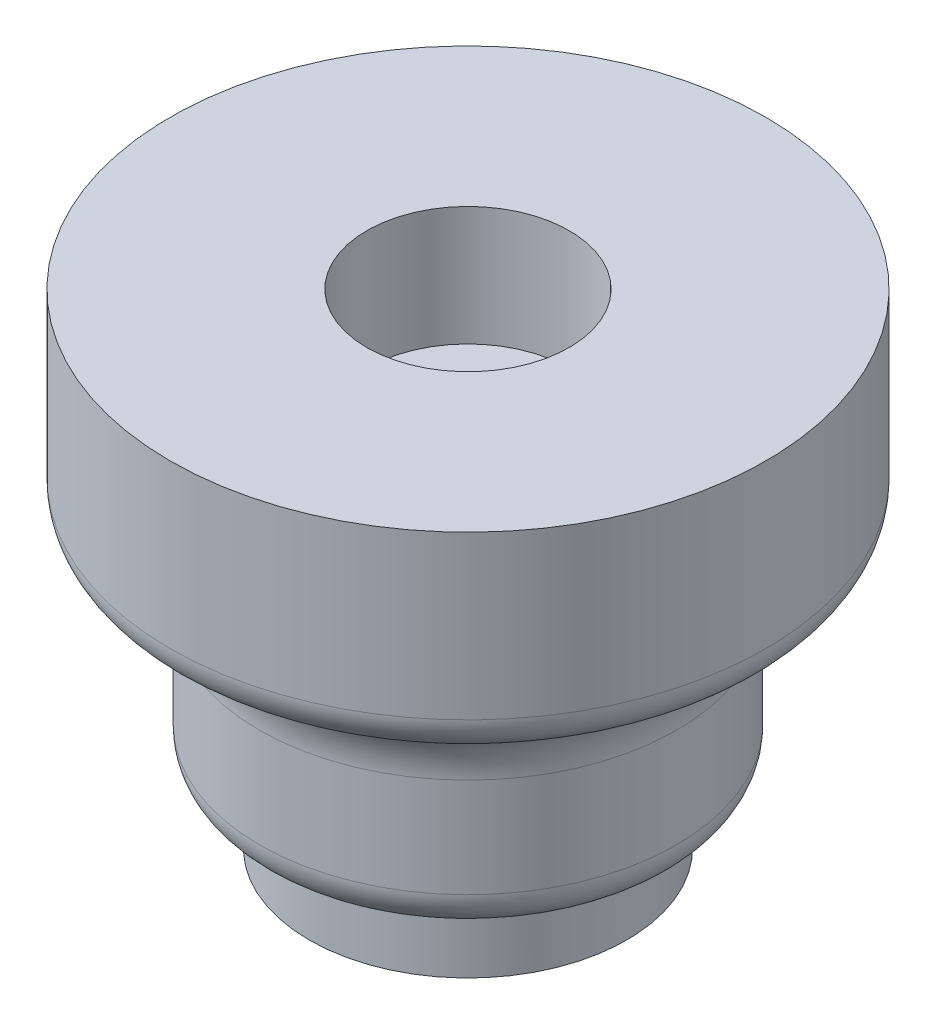
ISO-10303-21;
HEADER;
FILE_DESCRIPTION(('STEP AP214'),'2;1');
FILE_NAME('part.step','',(''),(''),'','','');
FILE_SCHEMA(('AUTOMOTIVE_DESIGN { 1 0 10303 214 1 1 1 1 }'));
ENDSEC;
DATA;
#1=APPLICATION_CONTEXT('core data for automotive mechanical design processes');
#2=APPLICATION_PROTOCOL_DEFINITION('international standard','automotive_design',2000,#1);
#3=PRODUCT_CONTEXT('',#1,'mechanical');
#4=PRODUCT('Part','Part','',(#3));
#5=PRODUCT_RELATED_PRODUCT_CATEGORY('part','',(#4));
#6=PRODUCT_DEFINITION_FORMATION('','',#4);
#7=PRODUCT_DEFINITION_CONTEXT('part definition',#1,'design');
#8=PRODUCT_DEFINITION('design','',#6,#7);
#9=PRODUCT_DEFINITION_SHAPE('','',#8);
#10=(LENGTH_UNIT() NAMED_UNIT(*) SI_UNIT(.MILLI.,.METRE.));
#11=(NAMED_UNIT(*) PLANE_ANGLE_UNIT() SI_UNIT($,.RADIAN.));
#12=(NAMED_UNIT(*) SI_UNIT($,.STERADIAN.) SOLID_ANGLE_UNIT());
#13=UNCERTAINTY_MEASURE_WITH_UNIT(LENGTH_MEASURE(1.E-05),#10,'distance_accuracy_value','');
#14=(GEOMETRIC_REPRESENTATION_CONTEXT(3) GLOBAL_UNCERTAINTY_ASSIGNED_CONTEXT((#13)) GLOBAL_UNIT_ASSIGNED_CONTEXT((#10,
#11,#12)) REPRESENTATION_CONTEXT('',''));
#15=CARTESIAN_POINT('',(0.,0.,0.));
#16=DIRECTION('',(0.,0.,1.));
#17=DIRECTION('',(1.,0.,0.));
#18=AXIS2_PLACEMENT_3D('',#15,#16,#17);
#19=CARTESIAN_POINT('',(0.,5.5,0.));
#20=DIRECTION('',(0.,-1.,0.));
#21=DIRECTION('',(0.,0.,-1.));
#22=AXIS2_PLACEMENT_3D('',#19,#20,#21);
#23=CYLINDRICAL_SURFACE('',#22,5.25);
#24=CARTESIAN_POINT('',(0.,1.,0.));
#25=DIRECTION('',(0.,1.,0.));
#26=DIRECTION('',(0.,0.,1.));
#27=AXIS2_PLACEMENT_3D('',#24,#25,#26);
#28=CIRCLE('',#27,5.25);
#29=CARTESIAN_POINT('',(0.,1.,5.25));
#30=VERTEX_POINT('',#29);
#31=EDGE_CURVE('E197',#30,#30,#28,.T.);
#32=ORIENTED_EDGE('',*,*,#31,.T.);
#33=EDGE_LOOP('',(#32));
#34=FACE_BOUND('',#33,.T.);
#35=CARTESIAN_POINT('',(0.,3.5,0.));
#36=DIRECTION('',(0.,1.,0.));
#37=DIRECTION('',(0.,0.,1.));
#38=AXIS2_PLACEMENT_3D('',#35,#36,#37);
#39=CIRCLE('',#38,5.25);
#40=CARTESIAN_POINT('',(0.,3.5,5.25));
#41=VERTEX_POINT('',#40);
#42=EDGE_CURVE('E193',#41,#41,#39,.F.);
#43=ORIENTED_EDGE('',*,*,#42,.T.);
#44=EDGE_LOOP('',(#43));
#45=FACE_BOUND('',#44,.T.);
#46=ADVANCED_FACE('F45',(#34,#45),#23,.T.);
#47=CARTESIAN_POINT('',(0.,0.,0.));
#48=DIRECTION('',(0.,1.,0.));
#49=DIRECTION('',(0.,0.,1.));
#50=AXIS2_PLACEMENT_3D('',#47,#48,#49);
#51=PLANE('',#50);
#52=CARTESIAN_POINT('',(0.,0.,0.));
#53=DIRECTION('',(0.,1.,0.));
#54=DIRECTION('',(0.,0.,1.));
#55=AXIS2_PLACEMENT_3D('',#52,#53,#54);
#56=CIRCLE('',#55,4.25);
#57=CARTESIAN_POINT('',(0.,0.,4.25));
#58=VERTEX_POINT('',#57);
#59=EDGE_CURVE('E201',#58,#58,#56,.F.);
#60=ORIENTED_EDGE('',*,*,#59,.T.);
#61=EDGE_LOOP('',(#60));
#62=FACE_BOUND('',#61,.T.);
#63=CARTESIAN_POINT('',(0.,0.,0.));
#64=DIRECTION('',(0.,1.,0.));
#65=DIRECTION('',(0.,0.,1.));
#66=AXIS2_PLACEMENT_3D('',#63,#64,#65);
#67=CIRCLE('',#66,4.15);
#68=CARTESIAN_POINT('',(0.,0.,4.15));
#69=VERTEX_POINT('',#68);
#70=EDGE_CURVE('E189',#69,#69,#67,.T.);
#71=ORIENTED_EDGE('',*,*,#70,.T.);
#72=EDGE_LOOP('',(#71));
#73=FACE_BOUND('',#72,.T.);
#74=ADVANCED_FACE('F222',(#62,#73),#51,.F.);
#75=CARTESIAN_POINT('',(0.,-1.7,0.));
#76=DIRECTION('',(0.,1.,0.));
#77=DIRECTION('',(0.,0.,1.));
#78=AXIS2_PLACEMENT_3D('',#75,#76,#77);
#79=CYLINDRICAL_SURFACE('',#78,4.);
#80=CARTESIAN_POINT('',(0.,-0.15,0.));
#81=DIRECTION('',(0.,1.,0.));
#82=DIRECTION('',(0.,0.,1.));
#83=AXIS2_PLACEMENT_3D('',#80,#81,#82);
#84=CIRCLE('',#83,4.);
#85=CARTESIAN_POINT('',(0.,-0.15,4.));
#86=VERTEX_POINT('',#85);
#87=EDGE_CURVE('E185',#86,#86,#84,.F.);
#88=ORIENTED_EDGE('',*,*,#87,.T.);
#89=EDGE_LOOP('',(#88));
#90=FACE_BOUND('',#89,.T.);
#91=CARTESIAN_POINT('',(0.,-1.7,0.));
#92=DIRECTION('',(0.,-1.,0.));
#93=DIRECTION('',(0.,0.,-1.));
#94=AXIS2_PLACEMENT_3D('',#91,#92,#93);
#95=CIRCLE('',#94,4.);
#96=CARTESIAN_POINT('',(0.,-1.7,-4.));
#97=VERTEX_POINT('',#96);
#98=EDGE_CURVE('E181',#97,#97,#95,.T.);
#99=ORIENTED_EDGE('',*,*,#98,.F.);
#100=EDGE_LOOP('',(#99));
#101=FACE_BOUND('',#100,.T.);
#102=ADVANCED_FACE('F229',(#90,#101),#79,.T.);
#103=CARTESIAN_POINT('',(0.,-1.7,0.));
#104=DIRECTION('',(0.,-1.,0.));
#105=DIRECTION('',(0.,0.,-1.));
#106=AXIS2_PLACEMENT_3D('',#103,#104,#105);
#107=PLANE('',#106);
#108=DIRECTION('',(0.5,0.,0.866025403784439));
#109=VECTOR('',#108,1.);
#110=CARTESIAN_POINT('',(1.35677313259562,-1.7,-2.35));
#111=LINE('',#110,#109);
#112=CARTESIAN_POINT('',(1.35677313259562,-1.7,-2.35));
#113=VERTEX_POINT('',#112);
#114=CARTESIAN_POINT('',(2.71354626519124,-1.7,0.));
#115=VERTEX_POINT('',#114);
#116=EDGE_CURVE('E61',#113,#115,#111,.T.);
#117=ORIENTED_EDGE('',*,*,#116,.F.);
#118=DIRECTION('',(1.,0.,0.));
#119=VECTOR('',#118,1.);
#120=CARTESIAN_POINT('',(-1.35677313259562,-1.7,-2.35));
#121=LINE('',#120,#119);
#122=CARTESIAN_POINT('',(-1.35677313259562,-1.7,-2.35));
#123=VERTEX_POINT('',#122);
#124=EDGE_CURVE('E154',#123,#113,#121,.T.);
#125=ORIENTED_EDGE('',*,*,#124,.F.);
#126=DIRECTION('',(0.5,0.,-0.866025403784439));
#127=VECTOR('',#126,1.);
#128=CARTESIAN_POINT('',(-2.71354626519124,-1.7,0.));
#129=LINE('',#128,#127);
#130=CARTESIAN_POINT('',(-2.71354626519124,-1.7,0.));
#131=VERTEX_POINT('',#130);
#132=EDGE_CURVE('E151',#131,#123,#129,.T.);
#133=ORIENTED_EDGE('',*,*,#132,.F.);
#134=DIRECTION('',(-0.5,0.,-0.866025403784439));
#135=VECTOR('',#134,1.);
#136=CARTESIAN_POINT('',(-1.35677313259562,-1.7,2.35));
#137=LINE('',#136,#135);
#138=CARTESIAN_POINT('',(-1.35677313259562,-1.7,2.35));
#139=VERTEX_POINT('',#138);
#140=EDGE_CURVE('E109',#139,#131,#137,.T.);
#141=ORIENTED_EDGE('',*,*,#140,.F.);
#142=DIRECTION('',(-1.,0.,0.));
#143=VECTOR('',#142,1.);
#144=CARTESIAN_POINT('',(1.35677313259562,-1.7,2.35));
#145=LINE('',#144,#143);
#146=CARTESIAN_POINT('',(1.35677313259562,-1.7,2.35));
#147=VERTEX_POINT('',#146);
#148=EDGE_CURVE('E145',#147,#139,#145,.T.);
#149=ORIENTED_EDGE('',*,*,#148,.F.);
#150=DIRECTION('',(-0.5,0.,0.866025403784439));
#151=VECTOR('',#150,1.);
#152=CARTESIAN_POINT('',(2.71354626519124,-1.7,0.));
#153=LINE('',#152,#151);
#154=EDGE_CURVE('E141',#115,#147,#153,.T.);
#155=ORIENTED_EDGE('',*,*,#154,.F.);
#156=EDGE_LOOP('',(#117,#125,#133,#141,#149,#155));
#157=FACE_BOUND('',#156,.T.);
#158=ORIENTED_EDGE('',*,*,#98,.T.);
#159=EDGE_LOOP('',(#158));
#160=FACE_BOUND('',#159,.T.);
#161=ADVANCED_FACE('F238',(#157,#160),#107,.T.);
#162=CARTESIAN_POINT('',(0.,-0.15,0.));
#163=DIRECTION('',(0.,1.,0.));
#164=DIRECTION('',(0.,0.,1.));
#165=AXIS2_PLACEMENT_3D('',#162,#163,#164);
#166=TOROIDAL_SURFACE('',#165,4.15,0.15);
#167=ORIENTED_EDGE('',*,*,#70,.F.);
#168=EDGE_LOOP('',(#167));
#169=FACE_BOUND('',#168,.T.);
#170=ORIENTED_EDGE('',*,*,#87,.F.);
#171=EDGE_LOOP('',(#170));
#172=FACE_BOUND('',#171,.T.);
#173=ADVANCED_FACE('F235',(#169,#172),#166,.F.);
#174=CARTESIAN_POINT('',(0.,10.5,0.));
#175=DIRECTION('',(0.,-1.,0.));
#176=DIRECTION('',(0.,0.,-1.));
#177=AXIS2_PLACEMENT_3D('',#174,#175,#176);
#178=CYLINDRICAL_SURFACE('',#177,7.5);
#179=CARTESIAN_POINT('',(0.,6.40473750965556,0.));
#180=DIRECTION('',(0.,-1.,0.));
#181=DIRECTION('',(0.,0.,-1.));
#182=AXIS2_PLACEMENT_3D('',#179,#180,#181);
#183=CIRCLE('',#182,7.5);
#184=CARTESIAN_POINT('',(0.,6.40473750965556,-7.5));
#185=VERTEX_POINT('',#184);
#186=EDGE_CURVE('E54',#185,#185,#183,.F.);
#187=ORIENTED_EDGE('',*,*,#186,.T.);
#188=EDGE_LOOP('',(#187));
#189=FACE_BOUND('',#188,.T.);
#190=CARTESIAN_POINT('',(0.,10.5,0.));
#191=DIRECTION('',(0.,1.,0.));
#192=DIRECTION('',(0.,0.,1.));
#193=AXIS2_PLACEMENT_3D('',#190,#191,#192);
#194=CIRCLE('',#193,7.5);
#195=CARTESIAN_POINT('',(0.,10.5,7.5));
#196=VERTEX_POINT('',#195);
#197=EDGE_CURVE('E174',#196,#196,#194,.T.);
#198=ORIENTED_EDGE('',*,*,#197,.F.);
#199=EDGE_LOOP('',(#198));
#200=FACE_BOUND('',#199,.T.);
#201=ADVANCED_FACE('F208',(#189,#200),#178,.T.);
#202=CARTESIAN_POINT('',(0.,10.5,0.));
#203=DIRECTION('',(0.,1.,0.));
#204=DIRECTION('',(0.,0.,1.));
#205=AXIS2_PLACEMENT_3D('',#202,#203,#204);
#206=PLANE('',#205);
#207=CARTESIAN_POINT('',(0.,10.5,0.));
#208=DIRECTION('',(0.,1.,0.));
#209=DIRECTION('',(0.,0.,1.));
#210=AXIS2_PLACEMENT_3D('',#207,#208,#209);
#211=CIRCLE('',#210,2.55);
#212=CARTESIAN_POINT('',(0.,10.5,2.55));
#213=VERTEX_POINT('',#212);
#214=EDGE_CURVE('E160',#213,#213,#211,.T.);
#215=ORIENTED_EDGE('',*,*,#214,.F.);
#216=EDGE_LOOP('',(#215));
#217=FACE_BOUND('',#216,.T.);
#218=ORIENTED_EDGE('',*,*,#197,.T.);
#219=EDGE_LOOP('',(#218));
#220=FACE_BOUND('',#219,.T.);
#221=ADVANCED_FACE('F275',(#217,#220),#206,.T.);
#222=CARTESIAN_POINT('',(0.,7.5,0.));
#223=DIRECTION('',(0.,1.,0.));
#224=DIRECTION('',(0.,0.,1.));
#225=AXIS2_PLACEMENT_3D('',#222,#223,#224);
#226=CYLINDRICAL_SURFACE('',#225,2.55);
#227=CARTESIAN_POINT('',(0.,7.5,0.));
#228=DIRECTION('',(0.,1.,0.));
#229=DIRECTION('',(0.,0.,1.));
#230=AXIS2_PLACEMENT_3D('',#227,#228,#229);
#231=CIRCLE('',#230,2.55);
#232=CARTESIAN_POINT('',(0.,7.5,2.55));
#233=VERTEX_POINT('',#232);
#234=EDGE_CURVE('E170',#233,#233,#231,.T.);
#235=ORIENTED_EDGE('',*,*,#234,.F.);
#236=EDGE_LOOP('',(#235));
#237=FACE_BOUND('',#236,.T.);
#238=ORIENTED_EDGE('',*,*,#214,.T.);
#239=EDGE_LOOP('',(#238));
#240=FACE_BOUND('',#239,.T.);
#241=ADVANCED_FACE('F271',(#237,#240),#226,.F.);
#242=CARTESIAN_POINT('',(0.,7.5,0.));
#243=DIRECTION('',(0.,1.,0.));
#244=DIRECTION('',(0.,0.,1.));
#245=AXIS2_PLACEMENT_3D('',#242,#243,#244);
#246=PLANE('',#245);
#247=ORIENTED_EDGE('',*,*,#234,.T.);
#248=EDGE_LOOP('',(#247));
#249=FACE_BOUND('',#248,.T.);
#250=ADVANCED_FACE('F268',(#249),#246,.T.);
#251=CARTESIAN_POINT('',(1.35677313259562,3.,-2.35));
#252=DIRECTION('',(0.866025403784439,0.,-0.5));
#253=DIRECTION('',(-0.5,0.,-0.866025403784439));
#254=AXIS2_PLACEMENT_3D('',#251,#252,#253);
#255=PLANE('',#254);
#256=ORIENTED_EDGE('',*,*,#116,.T.);
#257=DIRECTION('',(0.,-1.,0.));
#258=VECTOR('',#257,1.);
#259=CARTESIAN_POINT('',(2.71354626519124,3.,0.));
#260=LINE('',#259,#258);
#261=CARTESIAN_POINT('',(2.71354626519124,3.,0.));
#262=VERTEX_POINT('',#261);
#263=EDGE_CURVE('E91',#262,#115,#260,.T.);
#264=ORIENTED_EDGE('',*,*,#263,.F.);
#265=DIRECTION('',(0.5,0.,0.866025403784439));
#266=VECTOR('',#265,1.);
#267=CARTESIAN_POINT('',(1.35677313259562,3.,-2.35));
#268=LINE('',#267,#266);
#269=CARTESIAN_POINT('',(1.35677313259562,3.,-2.35));
#270=VERTEX_POINT('',#269);
#271=EDGE_CURVE('E157',#270,#262,#268,.T.);
#272=ORIENTED_EDGE('',*,*,#271,.F.);
#273=DIRECTION('',(0.,-1.,0.));
#274=VECTOR('',#273,1.);
#275=CARTESIAN_POINT('',(1.35677313259562,3.,-2.35));
#276=LINE('',#275,#274);
#277=EDGE_CURVE('E69',#270,#113,#276,.T.);
#278=ORIENTED_EDGE('',*,*,#277,.T.);
#279=EDGE_LOOP('',(#256,#264,#272,#278));
#280=FACE_BOUND('',#279,.T.);
#281=ADVANCED_FACE('F258',(#280),#255,.F.);
#282=CARTESIAN_POINT('',(-1.35677313259562,3.,-2.35));
#283=DIRECTION('',(0.,0.,-1.));
#284=DIRECTION('',(-1.,0.,0.));
#285=AXIS2_PLACEMENT_3D('',#282,#283,#284);
#286=PLANE('',#285);
#287=ORIENTED_EDGE('',*,*,#124,.T.);
#288=ORIENTED_EDGE('',*,*,#277,.F.);
#289=DIRECTION('',(1.,0.,0.));
#290=VECTOR('',#289,1.);
#291=CARTESIAN_POINT('',(-1.35677313259562,3.,-2.35));
#292=LINE('',#291,#290);
#293=CARTESIAN_POINT('',(-1.35677313259562,3.,-2.35));
#294=VERTEX_POINT('',#293);
#295=EDGE_CURVE('E123',#294,#270,#292,.T.);
#296=ORIENTED_EDGE('',*,*,#295,.F.);
#297=DIRECTION('',(0.,-1.,0.));
#298=VECTOR('',#297,1.);
#299=CARTESIAN_POINT('',(-1.35677313259562,3.,-2.35));
#300=LINE('',#299,#298);
#301=EDGE_CURVE('E114',#294,#123,#300,.T.);
#302=ORIENTED_EDGE('',*,*,#301,.T.);
#303=EDGE_LOOP('',(#287,#288,#296,#302));
#304=FACE_BOUND('',#303,.T.);
#305=ADVANCED_FACE('F255',(#304),#286,.F.);
#306=CARTESIAN_POINT('',(-2.71354626519124,3.,0.));
#307=DIRECTION('',(-0.866025403784439,0.,-0.5));
#308=DIRECTION('',(-0.5,0.,0.866025403784439));
#309=AXIS2_PLACEMENT_3D('',#306,#307,#308);
#310=PLANE('',#309);
#311=ORIENTED_EDGE('',*,*,#132,.T.);
#312=ORIENTED_EDGE('',*,*,#301,.F.);
#313=DIRECTION('',(0.5,0.,-0.866025403784439));
#314=VECTOR('',#313,1.);
#315=CARTESIAN_POINT('',(-2.71354626519124,3.,0.));
#316=LINE('',#315,#314);
#317=CARTESIAN_POINT('',(-2.71354626519124,3.,0.));
#318=VERTEX_POINT('',#317);
#319=EDGE_CURVE('E118',#318,#294,#316,.T.);
#320=ORIENTED_EDGE('',*,*,#319,.F.);
#321=DIRECTION('',(0.,-1.,0.));
#322=VECTOR('',#321,1.);
#323=CARTESIAN_POINT('',(-2.71354626519124,3.,0.));
#324=LINE('',#323,#322);
#325=EDGE_CURVE('E102',#318,#131,#324,.T.);
#326=ORIENTED_EDGE('',*,*,#325,.T.);
#327=EDGE_LOOP('',(#311,#312,#320,#326));
#328=FACE_BOUND('',#327,.T.);
#329=ADVANCED_FACE('F119',(#328),#310,.F.);
#330=CARTESIAN_POINT('',(-1.35677313259562,3.,2.35));
#331=DIRECTION('',(-0.866025403784439,0.,0.5));
#332=DIRECTION('',(0.5,0.,0.866025403784439));
#333=AXIS2_PLACEMENT_3D('',#330,#331,#332);
#334=PLANE('',#333);
#335=ORIENTED_EDGE('',*,*,#140,.T.);
#336=ORIENTED_EDGE('',*,*,#325,.F.);
#337=DIRECTION('',(-0.5,0.,-0.866025403784439));
#338=VECTOR('',#337,1.);
#339=CARTESIAN_POINT('',(-1.35677313259562,3.,2.35));
#340=LINE('',#339,#338);
#341=CARTESIAN_POINT('',(-1.35677313259562,3.,2.35));
#342=VERTEX_POINT('',#341);
#343=EDGE_CURVE('E106',#342,#318,#340,.T.);
#344=ORIENTED_EDGE('',*,*,#343,.F.);
#345=DIRECTION('',(0.,-1.,0.));
#346=VECTOR('',#345,1.);
#347=CARTESIAN_POINT('',(-1.35677313259562,3.,2.35));
#348=LINE('',#347,#346);
#349=EDGE_CURVE('E115',#342,#139,#348,.T.);
#350=ORIENTED_EDGE('',*,*,#349,.T.);
#351=EDGE_LOOP('',(#335,#336,#344,#350));
#352=FACE_BOUND('',#351,.T.);
#353=ADVANCED_FACE('F104',(#352),#334,.F.);
#354=CARTESIAN_POINT('',(1.35677313259562,3.,2.35));
#355=DIRECTION('',(0.,0.,1.));
#356=DIRECTION('',(1.,0.,0.));
#357=AXIS2_PLACEMENT_3D('',#354,#355,#356);
#358=PLANE('',#357);
#359=ORIENTED_EDGE('',*,*,#148,.T.);
#360=ORIENTED_EDGE('',*,*,#349,.F.);
#361=DIRECTION('',(-1.,0.,0.));
#362=VECTOR('',#361,1.);
#363=CARTESIAN_POINT('',(1.35677313259562,3.,2.35));
#364=LINE('',#363,#362);
#365=CARTESIAN_POINT('',(1.35677313259562,3.,2.35));
#366=VERTEX_POINT('',#365);
#367=EDGE_CURVE('E129',#366,#342,#364,.T.);
#368=ORIENTED_EDGE('',*,*,#367,.F.);
#369=DIRECTION('',(0.,-1.,0.));
#370=VECTOR('',#369,1.);
#371=CARTESIAN_POINT('',(1.35677313259562,3.,2.35));
#372=LINE('',#371,#370);
#373=EDGE_CURVE('E165',#366,#147,#372,.T.);
#374=ORIENTED_EDGE('',*,*,#373,.T.);
#375=EDGE_LOOP('',(#359,#360,#368,#374));
#376=FACE_BOUND('',#375,.T.);
#377=ADVANCED_FACE('F251',(#376),#358,.F.);
#378=CARTESIAN_POINT('',(2.71354626519124,3.,0.));
#379=DIRECTION('',(0.866025403784439,0.,0.5));
#380=DIRECTION('',(0.5,0.,-0.866025403784439));
#381=AXIS2_PLACEMENT_3D('',#378,#379,#380);
#382=PLANE('',#381);
#383=ORIENTED_EDGE('',*,*,#154,.T.);
#384=ORIENTED_EDGE('',*,*,#373,.F.);
#385=DIRECTION('',(-0.5,0.,0.866025403784439));
#386=VECTOR('',#385,1.);
#387=CARTESIAN_POINT('',(2.71354626519124,3.,0.));
#388=LINE('',#387,#386);
#389=EDGE_CURVE('E133',#262,#366,#388,.T.);
#390=ORIENTED_EDGE('',*,*,#389,.F.);
#391=ORIENTED_EDGE('',*,*,#263,.T.);
#392=EDGE_LOOP('',(#383,#384,#390,#391));
#393=FACE_BOUND('',#392,.T.);
#394=ADVANCED_FACE('F244',(#393),#382,.F.);
#395=CARTESIAN_POINT('',(0.,3.,0.));
#396=DIRECTION('',(0.,-1.,0.));
#397=DIRECTION('',(0.,0.,-1.));
#398=AXIS2_PLACEMENT_3D('',#395,#396,#397);
#399=PLANE('',#398);
#400=ORIENTED_EDGE('',*,*,#271,.T.);
#401=ORIENTED_EDGE('',*,*,#389,.T.);
#402=ORIENTED_EDGE('',*,*,#367,.T.);
#403=ORIENTED_EDGE('',*,*,#343,.T.);
#404=ORIENTED_EDGE('',*,*,#319,.T.);
#405=ORIENTED_EDGE('',*,*,#295,.T.);
#406=EDGE_LOOP('',(#400,#401,#402,#403,#404,#405));
#407=FACE_BOUND('',#406,.T.);
#408=ADVANCED_FACE('F126',(#407),#399,.T.);
#409=CARTESIAN_POINT('',(0.,3.5,0.));
#410=DIRECTION('',(0.,1.,0.));
#411=DIRECTION('',(0.,0.,1.));
#412=AXIS2_PLACEMENT_3D('',#409,#410,#411);
#413=TOROIDAL_SURFACE('',#412,7.25,2.);
#414=CARTESIAN_POINT('',(0.,5.43649167310375,0.));
#415=DIRECTION('',(0.,-1.,0.));
#416=DIRECTION('',(0.,0.,-1.));
#417=AXIS2_PLACEMENT_3D('',#414,#415,#416);
#418=CIRCLE('',#417,6.74999999999999);
#419=CARTESIAN_POINT('',(0.,5.43649167310375,-6.74999999999999));
#420=VERTEX_POINT('',#419);
#421=EDGE_CURVE('E11',#420,#420,#418,.T.);
#422=ORIENTED_EDGE('',*,*,#421,.T.);
#423=EDGE_LOOP('',(#422));
#424=FACE_BOUND('',#423,.T.);
#425=ORIENTED_EDGE('',*,*,#42,.F.);
#426=EDGE_LOOP('',(#425));
#427=FACE_BOUND('',#426,.T.);
#428=ADVANCED_FACE('F218',(#424,#427),#413,.F.);
#429=CARTESIAN_POINT('',(0.,1.,0.));
#430=DIRECTION('',(0.,1.,0.));
#431=DIRECTION('',(0.,0.,1.));
#432=AXIS2_PLACEMENT_3D('',#429,#430,#431);
#433=TOROIDAL_SURFACE('',#432,4.25,1.);
#434=ORIENTED_EDGE('',*,*,#59,.F.);
#435=EDGE_LOOP('',(#434));
#436=FACE_BOUND('',#435,.T.);
#437=ORIENTED_EDGE('',*,*,#31,.F.);
#438=EDGE_LOOP('',(#437));
#439=FACE_BOUND('',#438,.T.);
#440=ADVANCED_FACE('F212',(#436,#439),#433,.T.);
#441=CARTESIAN_POINT('',(0.,6.40473750965556,0.));
#442=DIRECTION('',(0.,-1.,0.));
#443=DIRECTION('',(0.,0.,-1.));
#444=AXIS2_PLACEMENT_3D('',#441,#442,#443);
#445=TOROIDAL_SURFACE('',#444,6.5,1.);
#446=ORIENTED_EDGE('',*,*,#421,.F.);
#447=EDGE_LOOP('',(#446));
#448=FACE_BOUND('',#447,.T.);
#449=ORIENTED_EDGE('',*,*,#186,.F.);
#450=EDGE_LOOP('',(#449));
#451=FACE_BOUND('',#450,.T.);
#452=ADVANCED_FACE('F47',(#448,#451),#445,.T.);
#453=CLOSED_SHELL('',(#46,#74,#102,#161,#173,#201,#221,#241,#250,#281,#305,#329,#353,#377,#394,
#408,#428,#440,#452));
#454=MANIFOLD_SOLID_BREP('B2',#453);
#455=ADVANCED_BREP_SHAPE_REPRESENTATION('',(#18,#454),#14);
#456=SHAPE_DEFINITION_REPRESENTATION(#9,#455);
ENDSEC;
END-ISO-10303-21;
